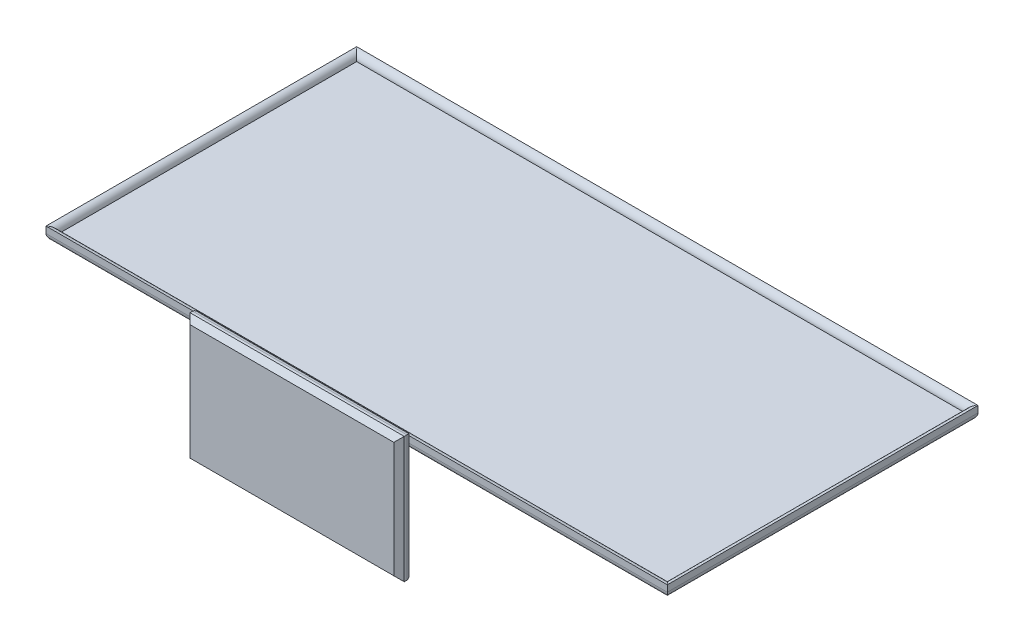
ISO-10303-21;
HEADER;
FILE_DESCRIPTION(('STEP AP214'),'2;1');
FILE_NAME('part.step','',(''),(''),'','','');
FILE_SCHEMA(('AUTOMOTIVE_DESIGN { 1 0 10303 214 1 1 1 1 }'));
ENDSEC;
DATA;
#1=APPLICATION_CONTEXT('core data for automotive mechanical design processes');
#2=APPLICATION_PROTOCOL_DEFINITION('international standard','automotive_design',2000,#1);
#3=PRODUCT_CONTEXT('',#1,'mechanical');
#4=PRODUCT('Part','Part','',(#3));
#5=PRODUCT_RELATED_PRODUCT_CATEGORY('part','',(#4));
#6=PRODUCT_DEFINITION_FORMATION('','',#4);
#7=PRODUCT_DEFINITION_CONTEXT('part definition',#1,'design');
#8=PRODUCT_DEFINITION('design','',#6,#7);
#9=PRODUCT_DEFINITION_SHAPE('','',#8);
#10=(LENGTH_UNIT() NAMED_UNIT(*) SI_UNIT(.MILLI.,.METRE.));
#11=(NAMED_UNIT(*) PLANE_ANGLE_UNIT() SI_UNIT($,.RADIAN.));
#12=(NAMED_UNIT(*) SI_UNIT($,.STERADIAN.) SOLID_ANGLE_UNIT());
#13=UNCERTAINTY_MEASURE_WITH_UNIT(LENGTH_MEASURE(1.E-05),#10,'distance_accuracy_value','');
#14=(GEOMETRIC_REPRESENTATION_CONTEXT(3) GLOBAL_UNCERTAINTY_ASSIGNED_CONTEXT((#13)) GLOBAL_UNIT_ASSIGNED_CONTEXT((#10,
#11,#12)) REPRESENTATION_CONTEXT('',''));
#15=CARTESIAN_POINT('',(0.,0.,0.));
#16=DIRECTION('',(0.,0.,1.));
#17=DIRECTION('',(1.,0.,0.));
#18=AXIS2_PLACEMENT_3D('',#15,#16,#17);
#19=CARTESIAN_POINT('',(-6.,0.25,3.));
#20=DIRECTION('',(0.,0.,-1.));
#21=DIRECTION('',(-1.,0.,0.));
#22=AXIS2_PLACEMENT_3D('',#19,#20,#21);
#23=PLANE('',#22);
#24=DIRECTION('',(0.,1.,0.));
#25=VECTOR('',#24,1.);
#26=CARTESIAN_POINT('',(0.148578956203547,0.,3.));
#27=LINE('',#26,#25);
#28=CARTESIAN_POINT('',(0.148578956203547,0.125,3.));
#29=VERTEX_POINT('',#28);
#30=CARTESIAN_POINT('',(0.148578956203547,0.150000000000001,3.));
#31=VERTEX_POINT('',#30);
#32=EDGE_CURVE('E544',#29,#31,#27,.T.);
#33=ORIENTED_EDGE('',*,*,#32,.F.);
#34=DIRECTION('',(1.,0.,0.));
#35=VECTOR('',#34,1.);
#36=CARTESIAN_POINT('',(6.,0.125,3.));
#37=LINE('',#36,#35);
#38=CARTESIAN_POINT('',(6.,0.125,3.));
#39=VERTEX_POINT('',#38);
#40=EDGE_CURVE('E499',#29,#39,#37,.T.);
#41=ORIENTED_EDGE('',*,*,#40,.T.);
#42=DIRECTION('',(0.,-1.,0.));
#43=VECTOR('',#42,1.);
#44=CARTESIAN_POINT('',(6.,0.25,3.));
#45=LINE('',#44,#43);
#46=CARTESIAN_POINT('',(6.,0.25,3.));
#47=VERTEX_POINT('',#46);
#48=EDGE_CURVE('E368',#47,#39,#45,.T.);
#49=ORIENTED_EDGE('',*,*,#48,.F.);
#50=DIRECTION('',(1.,0.,0.));
#51=VECTOR('',#50,1.);
#52=CARTESIAN_POINT('',(-6.,0.25,3.));
#53=LINE('',#52,#51);
#54=CARTESIAN_POINT('',(0.0485789562035491,0.25,3.));
#55=VERTEX_POINT('',#54);
#56=EDGE_CURVE('E365',#55,#47,#53,.T.);
#57=ORIENTED_EDGE('',*,*,#56,.F.);
#58=DIRECTION('',(-0.707106781186541,0.707106781186554,0.));
#59=VECTOR('',#58,1.);
#60=CARTESIAN_POINT('',(-2.97571052189817,3.27428947810178,3.));
#61=LINE('',#60,#59);
#62=EDGE_CURVE('E475',#55,#31,#61,.F.);
#63=ORIENTED_EDGE('',*,*,#62,.T.);
#64=EDGE_LOOP('',(#33,#41,#49,#57,#63));
#65=FACE_BOUND('',#64,.T.);
#66=ADVANCED_FACE('F153',(#65),#23,.F.);
#67=DIRECTION('',(0.,-1.,0.));
#68=VECTOR('',#67,1.);
#69=CARTESIAN_POINT('',(-6.,0.25,3.));
#70=LINE('',#69,#68);
#71=CARTESIAN_POINT('',(-6.,0.25,3.));
#72=VERTEX_POINT('',#71);
#73=CARTESIAN_POINT('',(-6.,0.125,3.));
#74=VERTEX_POINT('',#73);
#75=EDGE_CURVE('E371',#72,#74,#70,.T.);
#76=ORIENTED_EDGE('',*,*,#75,.T.);
#77=DIRECTION('',(1.,0.,0.));
#78=VECTOR('',#77,1.);
#79=CARTESIAN_POINT('',(-0.0514210437964555,0.125,3.));
#80=LINE('',#79,#78);
#81=CARTESIAN_POINT('',(-0.151421043796453,0.125,3.));
#82=VERTEX_POINT('',#81);
#83=EDGE_CURVE('E501',#74,#82,#80,.T.);
#84=ORIENTED_EDGE('',*,*,#83,.T.);
#85=DIRECTION('',(0.,-1.,0.));
#86=VECTOR('',#85,1.);
#87=CARTESIAN_POINT('',(-0.151421043796453,0.,3.));
#88=LINE('',#87,#86);
#89=CARTESIAN_POINT('',(-0.151421043796453,0.150000000000002,3.));
#90=VERTEX_POINT('',#89);
#91=EDGE_CURVE('E537',#90,#82,#88,.T.);
#92=ORIENTED_EDGE('',*,*,#91,.F.);
#93=DIRECTION('',(-0.707106781186554,-0.707106781186541,0.));
#94=VECTOR('',#93,1.);
#95=CARTESIAN_POINT('',(-3.02571052189828,-2.72428947810177,3.));
#96=LINE('',#95,#94);
#97=CARTESIAN_POINT('',(-0.0514210437964537,0.25,3.));
#98=VERTEX_POINT('',#97);
#99=EDGE_CURVE('E480',#90,#98,#96,.F.);
#100=ORIENTED_EDGE('',*,*,#99,.T.);
#101=EDGE_CURVE('E366',#72,#98,#53,.T.);
#102=ORIENTED_EDGE('',*,*,#101,.F.);
#103=EDGE_LOOP('',(#76,#84,#92,#100,#102));
#104=FACE_BOUND('',#103,.T.);
#105=ADVANCED_FACE('F536',(#104),#23,.F.);
#106=CARTESIAN_POINT('',(0.,0.25,0.));
#107=DIRECTION('',(0.,-1.,0.));
#108=DIRECTION('',(0.,0.,-1.));
#109=AXIS2_PLACEMENT_3D('',#106,#107,#108);
#110=PLANE('',#109);
#111=DIRECTION('',(-1.,0.,0.));
#112=VECTOR('',#111,1.);
#113=CARTESIAN_POINT('',(-0.151421043796453,0.25,4.));
#114=LINE('',#113,#112);
#115=CARTESIAN_POINT('',(0.0485789562035491,0.25,4.));
#116=VERTEX_POINT('',#115);
#117=CARTESIAN_POINT('',(-0.0514210437964538,0.25,4.));
#118=VERTEX_POINT('',#117);
#119=EDGE_CURVE('E547',#116,#118,#114,.T.);
#120=ORIENTED_EDGE('',*,*,#119,.F.);
#121=DIRECTION('',(0.,0.,-1.));
#122=VECTOR('',#121,1.);
#123=CARTESIAN_POINT('',(0.0485789562035491,0.25,0.));
#124=LINE('',#123,#122);
#125=EDGE_CURVE('E468',#116,#55,#124,.T.);
#126=ORIENTED_EDGE('',*,*,#125,.T.);
#127=DIRECTION('',(1.,0.,0.));
#128=VECTOR('',#127,1.);
#129=CARTESIAN_POINT('',(-5.875,0.25,3.));
#130=LINE('',#129,#128);
#131=EDGE_CURVE('E432',#55,#98,#130,.F.);
#132=ORIENTED_EDGE('',*,*,#131,.T.);
#133=DIRECTION('',(0.,0.,1.));
#134=VECTOR('',#133,1.);
#135=CARTESIAN_POINT('',(-0.0514210437964538,0.25,0.));
#136=LINE('',#135,#134);
#137=EDGE_CURVE('E466',#98,#118,#136,.T.);
#138=ORIENTED_EDGE('',*,*,#137,.T.);
#139=EDGE_LOOP('',(#120,#126,#132,#138));
#140=FACE_BOUND('',#139,.T.);
#141=ADVANCED_FACE('F644',(#140),#110,.F.);
#142=CARTESIAN_POINT('',(6.,0.25,3.));
#143=DIRECTION('',(-1.,0.,0.));
#144=DIRECTION('',(0.,0.,1.));
#145=AXIS2_PLACEMENT_3D('',#142,#143,#144);
#146=PLANE('',#145);
#147=ORIENTED_EDGE('',*,*,#48,.T.);
#148=DIRECTION('',(0.,0.,-1.));
#149=VECTOR('',#148,1.);
#150=CARTESIAN_POINT('',(6.,0.125,-3.));
#151=LINE('',#150,#149);
#152=CARTESIAN_POINT('',(6.,0.125,-3.));
#153=VERTEX_POINT('',#152);
#154=EDGE_CURVE('E485',#39,#153,#151,.T.);
#155=ORIENTED_EDGE('',*,*,#154,.T.);
#156=DIRECTION('',(0.,-1.,0.));
#157=VECTOR('',#156,1.);
#158=CARTESIAN_POINT('',(6.,0.25,-3.));
#159=LINE('',#158,#157);
#160=CARTESIAN_POINT('',(6.,0.25,-3.));
#161=VERTEX_POINT('',#160);
#162=EDGE_CURVE('E377',#161,#153,#159,.T.);
#163=ORIENTED_EDGE('',*,*,#162,.F.);
#164=DIRECTION('',(0.,0.,-1.));
#165=VECTOR('',#164,1.);
#166=CARTESIAN_POINT('',(6.,0.25,3.));
#167=LINE('',#166,#165);
#168=EDGE_CURVE('E334',#47,#161,#167,.T.);
#169=ORIENTED_EDGE('',*,*,#168,.F.);
#170=EDGE_LOOP('',(#147,#155,#163,#169));
#171=FACE_BOUND('',#170,.T.);
#172=ADVANCED_FACE('F656',(#171),#146,.F.);
#173=CARTESIAN_POINT('',(-6.,0.25,-3.));
#174=DIRECTION('',(0.,0.,1.));
#175=DIRECTION('',(1.,0.,0.));
#176=AXIS2_PLACEMENT_3D('',#173,#174,#175);
#177=PLANE('',#176);
#178=ORIENTED_EDGE('',*,*,#162,.T.);
#179=DIRECTION('',(-1.,0.,0.));
#180=VECTOR('',#179,1.);
#181=CARTESIAN_POINT('',(-6.,0.125,-3.));
#182=LINE('',#181,#180);
#183=CARTESIAN_POINT('',(-6.,0.125,-3.));
#184=VERTEX_POINT('',#183);
#185=EDGE_CURVE('E505',#153,#184,#182,.T.);
#186=ORIENTED_EDGE('',*,*,#185,.T.);
#187=DIRECTION('',(0.,-1.,0.));
#188=VECTOR('',#187,1.);
#189=CARTESIAN_POINT('',(-6.,0.25,-3.));
#190=LINE('',#189,#188);
#191=CARTESIAN_POINT('',(-6.,0.25,-3.));
#192=VERTEX_POINT('',#191);
#193=EDGE_CURVE('E374',#192,#184,#190,.T.);
#194=ORIENTED_EDGE('',*,*,#193,.F.);
#195=DIRECTION('',(-1.,0.,0.));
#196=VECTOR('',#195,1.);
#197=CARTESIAN_POINT('',(-6.,0.25,-3.));
#198=LINE('',#197,#196);
#199=EDGE_CURVE('E340',#161,#192,#198,.T.);
#200=ORIENTED_EDGE('',*,*,#199,.F.);
#201=EDGE_LOOP('',(#178,#186,#194,#200));
#202=FACE_BOUND('',#201,.T.);
#203=ADVANCED_FACE('F652',(#202),#177,.F.);
#204=CARTESIAN_POINT('',(-6.,0.25,3.));
#205=DIRECTION('',(1.,0.,0.));
#206=DIRECTION('',(0.,0.,-1.));
#207=AXIS2_PLACEMENT_3D('',#204,#205,#206);
#208=PLANE('',#207);
#209=ORIENTED_EDGE('',*,*,#193,.T.);
#210=DIRECTION('',(0.,0.,1.));
#211=VECTOR('',#210,1.);
#212=CARTESIAN_POINT('',(-6.,0.125,3.));
#213=LINE('',#212,#211);
#214=EDGE_CURVE('E503',#184,#74,#213,.T.);
#215=ORIENTED_EDGE('',*,*,#214,.T.);
#216=ORIENTED_EDGE('',*,*,#75,.F.);
#217=DIRECTION('',(0.,0.,1.));
#218=VECTOR('',#217,1.);
#219=CARTESIAN_POINT('',(-6.,0.25,3.));
#220=LINE('',#219,#218);
#221=EDGE_CURVE('E363',#192,#72,#220,.T.);
#222=ORIENTED_EDGE('',*,*,#221,.F.);
#223=EDGE_LOOP('',(#209,#215,#216,#222));
#224=FACE_BOUND('',#223,.T.);
#225=ADVANCED_FACE('F649',(#224),#208,.F.);
#226=CARTESIAN_POINT('',(0.,0.,0.));
#227=DIRECTION('',(0.,-1.,0.));
#228=DIRECTION('',(0.,0.,-1.));
#229=AXIS2_PLACEMENT_3D('',#226,#227,#228);
#230=PLANE('',#229);
#231=DIRECTION('',(1.,0.,0.));
#232=VECTOR('',#231,1.);
#233=CARTESIAN_POINT('',(0.0485789562035474,0.,2.875));
#234=LINE('',#233,#232);
#235=CARTESIAN_POINT('',(5.875,0.,2.875));
#236=VERTEX_POINT('',#235);
#237=CARTESIAN_POINT('',(0.0485789562035474,0.,2.875));
#238=VERTEX_POINT('',#237);
#239=EDGE_CURVE('E496',#236,#238,#234,.F.);
#240=ORIENTED_EDGE('',*,*,#239,.T.);
#241=DIRECTION('',(0.,0.,1.));
#242=VECTOR('',#241,1.);
#243=CARTESIAN_POINT('',(0.0485789562035474,0.,4.));
#244=LINE('',#243,#242);
#245=CARTESIAN_POINT('',(0.0485789562035474,0.,4.));
#246=VERTEX_POINT('',#245);
#247=EDGE_CURVE('E460',#238,#246,#244,.T.);
#248=ORIENTED_EDGE('',*,*,#247,.T.);
#249=DIRECTION('',(1.,0.,0.));
#250=VECTOR('',#249,1.);
#251=CARTESIAN_POINT('',(-0.151421043796453,0.,4.));
#252=LINE('',#251,#250);
#253=CARTESIAN_POINT('',(-0.0514210437964555,0.,4.));
#254=VERTEX_POINT('',#253);
#255=EDGE_CURVE('E554',#254,#246,#252,.T.);
#256=ORIENTED_EDGE('',*,*,#255,.F.);
#257=DIRECTION('',(0.,0.,-1.));
#258=VECTOR('',#257,1.);
#259=CARTESIAN_POINT('',(-0.0514210437964555,0.,3.));
#260=LINE('',#259,#258);
#261=CARTESIAN_POINT('',(-0.0514210437964555,0.,2.875));
#262=VERTEX_POINT('',#261);
#263=EDGE_CURVE('E458',#254,#262,#260,.T.);
#264=ORIENTED_EDGE('',*,*,#263,.T.);
#265=DIRECTION('',(1.,0.,0.));
#266=VECTOR('',#265,1.);
#267=CARTESIAN_POINT('',(-6.,0.,2.875));
#268=LINE('',#267,#266);
#269=CARTESIAN_POINT('',(-5.875,0.,2.875));
#270=VERTEX_POINT('',#269);
#271=EDGE_CURVE('E492',#262,#270,#268,.F.);
#272=ORIENTED_EDGE('',*,*,#271,.T.);
#273=DIRECTION('',(0.,0.,1.));
#274=VECTOR('',#273,1.);
#275=CARTESIAN_POINT('',(-5.875,0.,-3.));
#276=LINE('',#275,#274);
#277=CARTESIAN_POINT('',(-5.875,0.,-2.875));
#278=VERTEX_POINT('',#277);
#279=EDGE_CURVE('E490',#270,#278,#276,.F.);
#280=ORIENTED_EDGE('',*,*,#279,.T.);
#281=DIRECTION('',(-1.,0.,0.));
#282=VECTOR('',#281,1.);
#283=CARTESIAN_POINT('',(6.,0.,-2.875));
#284=LINE('',#283,#282);
#285=CARTESIAN_POINT('',(5.875,0.,-2.875));
#286=VERTEX_POINT('',#285);
#287=EDGE_CURVE('E488',#278,#286,#284,.F.);
#288=ORIENTED_EDGE('',*,*,#287,.T.);
#289=DIRECTION('',(0.,0.,-1.));
#290=VECTOR('',#289,1.);
#291=CARTESIAN_POINT('',(5.875,0.,3.));
#292=LINE('',#291,#290);
#293=EDGE_CURVE('E494',#286,#236,#292,.F.);
#294=ORIENTED_EDGE('',*,*,#293,.T.);
#295=EDGE_LOOP('',(#240,#248,#256,#264,#272,#280,#288,#294));
#296=FACE_BOUND('',#295,.T.);
#297=ADVANCED_FACE('F648',(#296),#230,.T.);
#298=CARTESIAN_POINT('',(0.,0.125,0.));
#299=DIRECTION('',(0.,-1.,0.));
#300=DIRECTION('',(0.,0.,-1.));
#301=AXIS2_PLACEMENT_3D('',#298,#299,#300);
#302=PLANE('',#301);
#303=DIRECTION('',(-1.,0.,0.));
#304=VECTOR('',#303,1.);
#305=CARTESIAN_POINT('',(5.875,0.125,-2.875));
#306=LINE('',#305,#304);
#307=CARTESIAN_POINT('',(5.875,0.125,-2.875));
#308=VERTEX_POINT('',#307);
#309=CARTESIAN_POINT('',(-5.875,0.125,-2.875));
#310=VERTEX_POINT('',#309);
#311=EDGE_CURVE('E322',#308,#310,#306,.T.);
#312=ORIENTED_EDGE('',*,*,#311,.T.);
#313=DIRECTION('',(0.,0.,1.));
#314=VECTOR('',#313,1.);
#315=CARTESIAN_POINT('',(-5.875,0.125,-2.875));
#316=LINE('',#315,#314);
#317=CARTESIAN_POINT('',(-5.875,0.125,2.875));
#318=VERTEX_POINT('',#317);
#319=EDGE_CURVE('E327',#310,#318,#316,.T.);
#320=ORIENTED_EDGE('',*,*,#319,.T.);
#321=DIRECTION('',(1.,0.,0.));
#322=VECTOR('',#321,1.);
#323=CARTESIAN_POINT('',(-5.875,0.125,2.875));
#324=LINE('',#323,#322);
#325=CARTESIAN_POINT('',(5.875,0.125,2.875));
#326=VERTEX_POINT('',#325);
#327=EDGE_CURVE('E350',#318,#326,#324,.T.);
#328=ORIENTED_EDGE('',*,*,#327,.T.);
#329=DIRECTION('',(0.,0.,-1.));
#330=VECTOR('',#329,1.);
#331=CARTESIAN_POINT('',(5.875,0.125,2.875));
#332=LINE('',#331,#330);
#333=EDGE_CURVE('E330',#326,#308,#332,.T.);
#334=ORIENTED_EDGE('',*,*,#333,.T.);
#335=EDGE_LOOP('',(#312,#320,#328,#334));
#336=FACE_BOUND('',#335,.T.);
#337=ADVANCED_FACE('F324',(#336),#302,.F.);
#338=CARTESIAN_POINT('',(0.148578956203547,0.,4.));
#339=DIRECTION('',(-1.,0.,0.));
#340=DIRECTION('',(0.,0.,1.));
#341=AXIS2_PLACEMENT_3D('',#338,#339,#340);
#342=PLANE('',#341);
#343=DIRECTION('',(0.,1.,0.));
#344=VECTOR('',#343,1.);
#345=CARTESIAN_POINT('',(0.148578956203547,0.,4.));
#346=LINE('',#345,#344);
#347=CARTESIAN_POINT('',(0.148578956203547,0.0999999999999977,4.));
#348=VERTEX_POINT('',#347);
#349=CARTESIAN_POINT('',(0.148578956203547,0.150000000000001,4.));
#350=VERTEX_POINT('',#349);
#351=EDGE_CURVE('E543',#348,#350,#346,.T.);
#352=ORIENTED_EDGE('',*,*,#351,.F.);
#353=DIRECTION('',(0.,0.,-1.));
#354=VECTOR('',#353,1.);
#355=CARTESIAN_POINT('',(0.148578956203547,0.0999999999999977,3.));
#356=LINE('',#355,#354);
#357=CARTESIAN_POINT('',(0.148578956203547,0.0999999999999977,2.99747448713916));
#358=VERTEX_POINT('',#357);
#359=EDGE_CURVE('E177',#348,#358,#356,.T.);
#360=ORIENTED_EDGE('',*,*,#359,.T.);
#361=CARTESIAN_POINT('',(0.148578956203547,0.125,2.875));
#362=DIRECTION('',(-1.,0.,0.));
#363=DIRECTION('',(0.,0.,1.));
#364=AXIS2_PLACEMENT_3D('',#361,#362,#363);
#365=CIRCLE('',#364,0.125);
#366=EDGE_CURVE('E509',#358,#29,#365,.T.);
#367=ORIENTED_EDGE('',*,*,#366,.T.);
#368=ORIENTED_EDGE('',*,*,#32,.T.);
#369=DIRECTION('',(0.,0.,1.));
#370=VECTOR('',#369,1.);
#371=CARTESIAN_POINT('',(0.148578956203547,0.150000000000001,4.));
#372=LINE('',#371,#370);
#373=EDGE_CURVE('E443',#31,#350,#372,.T.);
#374=ORIENTED_EDGE('',*,*,#373,.T.);
#375=EDGE_LOOP('',(#352,#360,#367,#368,#374));
#376=FACE_BOUND('',#375,.T.);
#377=ADVANCED_FACE('F686',(#376),#342,.F.);
#378=CARTESIAN_POINT('',(-0.151421043796453,0.,4.));
#379=DIRECTION('',(1.,0.,0.));
#380=DIRECTION('',(0.,0.,-1.));
#381=AXIS2_PLACEMENT_3D('',#378,#379,#380);
#382=PLANE('',#381);
#383=ORIENTED_EDGE('',*,*,#91,.T.);
#384=CARTESIAN_POINT('',(-0.151421043796453,0.125,2.875));
#385=DIRECTION('',(1.,0.,0.));
#386=DIRECTION('',(0.,0.,-1.));
#387=AXIS2_PLACEMENT_3D('',#384,#385,#386);
#388=CIRCLE('',#387,0.125);
#389=CARTESIAN_POINT('',(-0.151421043796453,0.0999999999999994,2.99747448713916));
#390=VERTEX_POINT('',#389);
#391=EDGE_CURVE('E162',#82,#390,#388,.T.);
#392=ORIENTED_EDGE('',*,*,#391,.T.);
#393=DIRECTION('',(0.,0.,1.));
#394=VECTOR('',#393,1.);
#395=CARTESIAN_POINT('',(-0.151421043796453,0.0999999999999994,4.));
#396=LINE('',#395,#394);
#397=CARTESIAN_POINT('',(-0.151421043796453,0.0999999999999994,4.));
#398=VERTEX_POINT('',#397);
#399=EDGE_CURVE('E169',#390,#398,#396,.T.);
#400=ORIENTED_EDGE('',*,*,#399,.T.);
#401=DIRECTION('',(0.,-1.,0.));
#402=VECTOR('',#401,1.);
#403=CARTESIAN_POINT('',(-0.151421043796453,0.,4.));
#404=LINE('',#403,#402);
#405=CARTESIAN_POINT('',(-0.151421043796453,0.150000000000002,4.));
#406=VERTEX_POINT('',#405);
#407=EDGE_CURVE('E557',#406,#398,#404,.T.);
#408=ORIENTED_EDGE('',*,*,#407,.F.);
#409=DIRECTION('',(0.,0.,-1.));
#410=VECTOR('',#409,1.);
#411=CARTESIAN_POINT('',(-0.151421043796453,0.150000000000002,4.));
#412=LINE('',#411,#410);
#413=EDGE_CURVE('E462',#406,#90,#412,.T.);
#414=ORIENTED_EDGE('',*,*,#413,.T.);
#415=EDGE_LOOP('',(#383,#392,#400,#408,#414));
#416=FACE_BOUND('',#415,.T.);
#417=ADVANCED_FACE('F540',(#416),#382,.F.);
#418=CARTESIAN_POINT('',(2.06809312727264,-1.09131512494069,4.25));
#419=DIRECTION('',(-1.,0.,0.));
#420=DIRECTION('',(0.,0.,1.));
#421=AXIS2_PLACEMENT_3D('',#418,#419,#420);
#422=PLANE('',#421);
#423=DIRECTION('',(0.,0.,-1.));
#424=VECTOR('',#423,1.);
#425=CARTESIAN_POINT('',(2.06809312727264,1.34131512494069,4.25));
#426=LINE('',#425,#424);
#427=CARTESIAN_POINT('',(2.06809312727264,1.34131512494069,4.15));
#428=VERTEX_POINT('',#427);
#429=CARTESIAN_POINT('',(2.06809312727264,1.34131512494069,4.1));
#430=VERTEX_POINT('',#429);
#431=EDGE_CURVE('E549',#428,#430,#426,.T.);
#432=ORIENTED_EDGE('',*,*,#431,.F.);
#433=DIRECTION('',(0.,-1.,0.));
#434=VECTOR('',#433,1.);
#435=CARTESIAN_POINT('',(2.06809312727264,-1.09131512494069,4.15));
#436=LINE('',#435,#434);
#437=CARTESIAN_POINT('',(2.06809312727264,-1.09131512494069,4.15));
#438=VERTEX_POINT('',#437);
#439=EDGE_CURVE('E428',#428,#438,#436,.T.);
#440=ORIENTED_EDGE('',*,*,#439,.T.);
#441=DIRECTION('',(0.,0.,-1.));
#442=VECTOR('',#441,1.);
#443=CARTESIAN_POINT('',(2.06809312727264,-1.09131512494069,4.25));
#444=LINE('',#443,#442);
#445=CARTESIAN_POINT('',(2.06809312727264,-1.09131512494069,4.1));
#446=VERTEX_POINT('',#445);
#447=EDGE_CURVE('E414',#438,#446,#444,.T.);
#448=ORIENTED_EDGE('',*,*,#447,.T.);
#449=DIRECTION('',(0.,1.,0.));
#450=VECTOR('',#449,1.);
#451=CARTESIAN_POINT('',(2.06809312727264,1.34131512494069,4.1));
#452=LINE('',#451,#450);
#453=EDGE_CURVE('E395',#446,#430,#452,.T.);
#454=ORIENTED_EDGE('',*,*,#453,.T.);
#455=EDGE_LOOP('',(#432,#440,#448,#454));
#456=FACE_BOUND('',#455,.T.);
#457=ADVANCED_FACE('F574',(#456),#422,.F.);
#458=CARTESIAN_POINT('',(-2.06809312727264,1.34131512494069,4.25));
#459=DIRECTION('',(0.,-1.,0.));
#460=DIRECTION('',(0.,0.,-1.));
#461=AXIS2_PLACEMENT_3D('',#458,#459,#460);
#462=PLANE('',#461);
#463=DIRECTION('',(0.,0.,-1.));
#464=VECTOR('',#463,1.);
#465=CARTESIAN_POINT('',(-2.06809312727264,1.34131512494069,4.25));
#466=LINE('',#465,#464);
#467=CARTESIAN_POINT('',(-2.06809312727264,1.34131512494069,4.15));
#468=VERTEX_POINT('',#467);
#469=CARTESIAN_POINT('',(-2.06809312727264,1.34131512494069,4.1));
#470=VERTEX_POINT('',#469);
#471=EDGE_CURVE('E567',#468,#470,#466,.T.);
#472=ORIENTED_EDGE('',*,*,#471,.F.);
#473=DIRECTION('',(1.,0.,0.));
#474=VECTOR('',#473,1.);
#475=CARTESIAN_POINT('',(-2.06809312727264,1.34131512494069,4.15));
#476=LINE('',#475,#474);
#477=EDGE_CURVE('E430',#468,#428,#476,.T.);
#478=ORIENTED_EDGE('',*,*,#477,.T.);
#479=ORIENTED_EDGE('',*,*,#431,.T.);
#480=DIRECTION('',(-1.,0.,0.));
#481=VECTOR('',#480,1.);
#482=CARTESIAN_POINT('',(-2.06809312727264,1.34131512494069,4.1));
#483=LINE('',#482,#481);
#484=EDGE_CURVE('E398',#430,#470,#483,.T.);
#485=ORIENTED_EDGE('',*,*,#484,.T.);
#486=EDGE_LOOP('',(#472,#478,#479,#485));
#487=FACE_BOUND('',#486,.T.);
#488=ADVANCED_FACE('F604',(#487),#462,.F.);
#489=CARTESIAN_POINT('',(-2.06809312727264,-1.09131512494069,4.25));
#490=DIRECTION('',(1.,0.,0.));
#491=DIRECTION('',(0.,0.,-1.));
#492=AXIS2_PLACEMENT_3D('',#489,#490,#491);
#493=PLANE('',#492);
#494=DIRECTION('',(0.,0.,-1.));
#495=VECTOR('',#494,1.);
#496=CARTESIAN_POINT('',(-2.06809312727264,-1.09131512494069,4.25));
#497=LINE('',#496,#495);
#498=CARTESIAN_POINT('',(-2.06809312727264,-1.09131512494069,4.15));
#499=VERTEX_POINT('',#498);
#500=CARTESIAN_POINT('',(-2.06809312727264,-1.09131512494069,4.1));
#501=VERTEX_POINT('',#500);
#502=EDGE_CURVE('E569',#499,#501,#497,.T.);
#503=ORIENTED_EDGE('',*,*,#502,.F.);
#504=DIRECTION('',(0.,1.,0.));
#505=VECTOR('',#504,1.);
#506=CARTESIAN_POINT('',(-2.06809312727264,-1.09131512494069,4.15));
#507=LINE('',#506,#505);
#508=EDGE_CURVE('E423',#499,#468,#507,.T.);
#509=ORIENTED_EDGE('',*,*,#508,.T.);
#510=ORIENTED_EDGE('',*,*,#471,.T.);
#511=DIRECTION('',(0.,-1.,0.));
#512=VECTOR('',#511,1.);
#513=CARTESIAN_POINT('',(-2.06809312727264,-1.09131512494069,4.1));
#514=LINE('',#513,#512);
#515=EDGE_CURVE('E380',#470,#501,#514,.T.);
#516=ORIENTED_EDGE('',*,*,#515,.T.);
#517=EDGE_LOOP('',(#503,#509,#510,#516));
#518=FACE_BOUND('',#517,.T.);
#519=ADVANCED_FACE('F624',(#518),#493,.F.);
#520=CARTESIAN_POINT('',(-2.06809312727264,-1.09131512494069,4.25));
#521=DIRECTION('',(0.,1.,0.));
#522=DIRECTION('',(0.,0.,1.));
#523=AXIS2_PLACEMENT_3D('',#520,#521,#522);
#524=PLANE('',#523);
#525=ORIENTED_EDGE('',*,*,#447,.F.);
#526=DIRECTION('',(-1.,0.,0.));
#527=VECTOR('',#526,1.);
#528=CARTESIAN_POINT('',(-2.06809312727264,-1.09131512494069,4.15));
#529=LINE('',#528,#527);
#530=EDGE_CURVE('E426',#438,#499,#529,.T.);
#531=ORIENTED_EDGE('',*,*,#530,.T.);
#532=ORIENTED_EDGE('',*,*,#502,.T.);
#533=DIRECTION('',(1.,0.,0.));
#534=VECTOR('',#533,1.);
#535=CARTESIAN_POINT('',(2.06809312727264,-1.09131512494069,4.1));
#536=LINE('',#535,#534);
#537=EDGE_CURVE('E392',#501,#446,#536,.T.);
#538=ORIENTED_EDGE('',*,*,#537,.T.);
#539=EDGE_LOOP('',(#525,#531,#532,#538));
#540=FACE_BOUND('',#539,.T.);
#541=ADVANCED_FACE('F581',(#540),#524,.F.);
#542=CARTESIAN_POINT('',(0.,0.,4.25));
#543=DIRECTION('',(0.,0.,-1.));
#544=DIRECTION('',(-1.,0.,0.));
#545=AXIS2_PLACEMENT_3D('',#542,#543,#544);
#546=PLANE('',#545);
#547=DIRECTION('',(-1.,0.,0.));
#548=VECTOR('',#547,1.);
#549=CARTESIAN_POINT('',(0.,1.24131512494069,4.25));
#550=LINE('',#549,#548);
#551=CARTESIAN_POINT('',(1.96809312727264,1.24131512494069,4.25));
#552=VERTEX_POINT('',#551);
#553=CARTESIAN_POINT('',(-1.96809312727264,1.24131512494069,4.25));
#554=VERTEX_POINT('',#553);
#555=EDGE_CURVE('E401',#552,#554,#550,.T.);
#556=ORIENTED_EDGE('',*,*,#555,.T.);
#557=DIRECTION('',(0.,-1.,0.));
#558=VECTOR('',#557,1.);
#559=CARTESIAN_POINT('',(-1.96809312727264,0.,4.25));
#560=LINE('',#559,#558);
#561=CARTESIAN_POINT('',(-1.96809312727264,-0.99131512494069,4.25));
#562=VERTEX_POINT('',#561);
#563=EDGE_CURVE('E420',#554,#562,#560,.T.);
#564=ORIENTED_EDGE('',*,*,#563,.T.);
#565=DIRECTION('',(1.,0.,0.));
#566=VECTOR('',#565,1.);
#567=CARTESIAN_POINT('',(0.,-0.99131512494069,4.25));
#568=LINE('',#567,#566);
#569=CARTESIAN_POINT('',(1.96809312727264,-0.99131512494069,4.25));
#570=VERTEX_POINT('',#569);
#571=EDGE_CURVE('E418',#562,#570,#568,.T.);
#572=ORIENTED_EDGE('',*,*,#571,.T.);
#573=DIRECTION('',(0.,1.,0.));
#574=VECTOR('',#573,1.);
#575=CARTESIAN_POINT('',(1.96809312727264,0.,4.25));
#576=LINE('',#575,#574);
#577=EDGE_CURVE('E416',#570,#552,#576,.T.);
#578=ORIENTED_EDGE('',*,*,#577,.T.);
#579=EDGE_LOOP('',(#556,#564,#572,#578));
#580=FACE_BOUND('',#579,.T.);
#581=ADVANCED_FACE('F617',(#580),#546,.F.);
#582=CARTESIAN_POINT('',(0.,0.,4.));
#583=DIRECTION('',(0.,0.,-1.));
#584=DIRECTION('',(-1.,0.,0.));
#585=AXIS2_PLACEMENT_3D('',#582,#583,#584);
#586=PLANE('',#585);
#587=DIRECTION('',(1.,0.,0.));
#588=VECTOR('',#587,1.);
#589=CARTESIAN_POINT('',(-2.06809312727264,-0.991315124940689,4.));
#590=LINE('',#589,#588);
#591=CARTESIAN_POINT('',(1.96809312727264,-0.991315124940689,4.));
#592=VERTEX_POINT('',#591);
#593=CARTESIAN_POINT('',(-1.96809312727264,-0.991315124940689,4.));
#594=VERTEX_POINT('',#593);
#595=EDGE_CURVE('E387',#592,#594,#590,.F.);
#596=ORIENTED_EDGE('',*,*,#595,.T.);
#597=DIRECTION('',(0.,-1.,0.));
#598=VECTOR('',#597,1.);
#599=CARTESIAN_POINT('',(-1.96809312727264,1.34131512494069,4.));
#600=LINE('',#599,#598);
#601=CARTESIAN_POINT('',(-1.96809312727264,1.24131512494069,4.));
#602=VERTEX_POINT('',#601);
#603=EDGE_CURVE('E389',#594,#602,#600,.F.);
#604=ORIENTED_EDGE('',*,*,#603,.T.);
#605=DIRECTION('',(-1.,0.,0.));
#606=VECTOR('',#605,1.);
#607=CARTESIAN_POINT('',(2.06809312727264,1.24131512494069,4.));
#608=LINE('',#607,#606);
#609=CARTESIAN_POINT('',(1.96809312727264,1.24131512494069,4.));
#610=VERTEX_POINT('',#609);
#611=EDGE_CURVE('E383',#602,#610,#608,.F.);
#612=ORIENTED_EDGE('',*,*,#611,.T.);
#613=DIRECTION('',(0.,1.,0.));
#614=VECTOR('',#613,1.);
#615=CARTESIAN_POINT('',(1.96809312727264,-1.09131512494069,4.));
#616=LINE('',#615,#614);
#617=EDGE_CURVE('E385',#610,#592,#616,.F.);
#618=ORIENTED_EDGE('',*,*,#617,.T.);
#619=EDGE_LOOP('',(#596,#604,#612,#618));
#620=FACE_BOUND('',#619,.T.);
#621=ORIENTED_EDGE('',*,*,#407,.T.);
#622=DIRECTION('',(0.707106781186541,-0.707106781186554,0.));
#623=VECTOR('',#622,1.);
#624=CARTESIAN_POINT('',(-0.0514210437964555,0.,4.));
#625=LINE('',#624,#623);
#626=EDGE_CURVE('E473',#398,#254,#625,.T.);
#627=ORIENTED_EDGE('',*,*,#626,.T.);
#628=ORIENTED_EDGE('',*,*,#255,.T.);
#629=DIRECTION('',(0.707106781186554,0.707106781186541,0.));
#630=VECTOR('',#629,1.);
#631=CARTESIAN_POINT('',(0.148578956203547,0.0999999999999977,4.));
#632=LINE('',#631,#630);
#633=EDGE_CURVE('E471',#246,#348,#632,.T.);
#634=ORIENTED_EDGE('',*,*,#633,.T.);
#635=ORIENTED_EDGE('',*,*,#351,.T.);
#636=DIRECTION('',(0.707106781186541,-0.707106781186554,0.));
#637=VECTOR('',#636,1.);
#638=CARTESIAN_POINT('',(0.0485789562035491,0.25,4.));
#639=LINE('',#638,#637);
#640=EDGE_CURVE('E478',#350,#116,#639,.F.);
#641=ORIENTED_EDGE('',*,*,#640,.T.);
#642=ORIENTED_EDGE('',*,*,#119,.T.);
#643=DIRECTION('',(0.707106781186554,0.707106781186541,0.));
#644=VECTOR('',#643,1.);
#645=CARTESIAN_POINT('',(-0.151421043796453,0.150000000000002,4.));
#646=LINE('',#645,#644);
#647=EDGE_CURVE('E483',#118,#406,#646,.F.);
#648=ORIENTED_EDGE('',*,*,#647,.T.);
#649=EDGE_LOOP('',(#621,#627,#628,#634,#635,#641,#642,#648));
#650=FACE_BOUND('',#649,.T.);
#651=ADVANCED_FACE('F594',(#620,#650),#586,.T.);
#652=CARTESIAN_POINT('',(1.96809312727264,-1.09131512494069,4.1));
#653=DIRECTION('',(0.,-1.,0.));
#654=DIRECTION('',(0.,0.,-1.));
#655=AXIS2_PLACEMENT_3D('',#652,#653,#654);
#656=CYLINDRICAL_SURFACE('',#655,0.1);
#657=CARTESIAN_POINT('',(1.96809312727264,-0.991315124940689,4.1));
#658=DIRECTION('',(-0.707106781186547,-0.707106781186547,0.));
#659=DIRECTION('',(0.707106781186547,-0.707106781186547,0.));
#660=AXIS2_PLACEMENT_3D('',#657,#658,#659);
#661=ELLIPSE('',#660,0.14142135623731,0.1);
#662=EDGE_CURVE('E408',#592,#446,#661,.T.);
#663=ORIENTED_EDGE('',*,*,#662,.F.);
#664=ORIENTED_EDGE('',*,*,#617,.F.);
#665=CARTESIAN_POINT('',(1.96809312727264,1.24131512494069,4.1));
#666=DIRECTION('',(0.707106781186547,-0.707106781186547,0.));
#667=DIRECTION('',(0.707106781186547,0.707106781186547,0.));
#668=AXIS2_PLACEMENT_3D('',#665,#666,#667);
#669=ELLIPSE('',#668,0.14142135623731,0.1);
#670=EDGE_CURVE('E411',#430,#610,#669,.F.);
#671=ORIENTED_EDGE('',*,*,#670,.F.);
#672=ORIENTED_EDGE('',*,*,#453,.F.);
#673=EDGE_LOOP('',(#663,#664,#671,#672));
#674=FACE_BOUND('',#673,.T.);
#675=ADVANCED_FACE('F587',(#674),#656,.T.);
#676=CARTESIAN_POINT('',(-2.06809312727264,1.24131512494069,4.1));
#677=DIRECTION('',(1.,0.,0.));
#678=DIRECTION('',(0.,0.,-1.));
#679=AXIS2_PLACEMENT_3D('',#676,#677,#678);
#680=CYLINDRICAL_SURFACE('',#679,0.1);
#681=ORIENTED_EDGE('',*,*,#670,.T.);
#682=ORIENTED_EDGE('',*,*,#611,.F.);
#683=CARTESIAN_POINT('',(-1.96809312727264,1.24131512494069,4.1));
#684=DIRECTION('',(0.707106781186547,0.707106781186547,0.));
#685=DIRECTION('',(0.707106781186547,-0.707106781186547,0.));
#686=AXIS2_PLACEMENT_3D('',#683,#684,#685);
#687=ELLIPSE('',#686,0.14142135623731,0.1);
#688=EDGE_CURVE('E405',#470,#602,#687,.F.);
#689=ORIENTED_EDGE('',*,*,#688,.F.);
#690=ORIENTED_EDGE('',*,*,#484,.F.);
#691=EDGE_LOOP('',(#681,#682,#689,#690));
#692=FACE_BOUND('',#691,.T.);
#693=ADVANCED_FACE('F601',(#692),#680,.T.);
#694=CARTESIAN_POINT('',(-2.06809312727264,-0.991315124940689,4.1));
#695=DIRECTION('',(-1.,0.,0.));
#696=DIRECTION('',(0.,0.,1.));
#697=AXIS2_PLACEMENT_3D('',#694,#695,#696);
#698=CYLINDRICAL_SURFACE('',#697,0.1);
#699=ORIENTED_EDGE('',*,*,#662,.T.);
#700=ORIENTED_EDGE('',*,*,#537,.F.);
#701=CARTESIAN_POINT('',(-1.96809312727264,-0.991315124940689,4.1));
#702=DIRECTION('',(-0.707106781186547,0.707106781186547,0.));
#703=DIRECTION('',(-0.707106781186547,-0.707106781186547,0.));
#704=AXIS2_PLACEMENT_3D('',#701,#702,#703);
#705=ELLIPSE('',#704,0.14142135623731,0.1);
#706=EDGE_CURVE('E402',#594,#501,#705,.T.);
#707=ORIENTED_EDGE('',*,*,#706,.F.);
#708=ORIENTED_EDGE('',*,*,#595,.F.);
#709=EDGE_LOOP('',(#699,#700,#707,#708));
#710=FACE_BOUND('',#709,.T.);
#711=ADVANCED_FACE('F591',(#710),#698,.T.);
#712=CARTESIAN_POINT('',(-1.96809312727264,-1.09131512494069,4.1));
#713=DIRECTION('',(0.,1.,0.));
#714=DIRECTION('',(0.,0.,1.));
#715=AXIS2_PLACEMENT_3D('',#712,#713,#714);
#716=CYLINDRICAL_SURFACE('',#715,0.1);
#717=ORIENTED_EDGE('',*,*,#688,.T.);
#718=ORIENTED_EDGE('',*,*,#603,.F.);
#719=ORIENTED_EDGE('',*,*,#706,.T.);
#720=ORIENTED_EDGE('',*,*,#515,.F.);
#721=EDGE_LOOP('',(#717,#718,#719,#720));
#722=FACE_BOUND('',#721,.T.);
#723=ADVANCED_FACE('F596',(#722),#716,.T.);
#724=CARTESIAN_POINT('',(1.96809312727264,0.,4.25));
#725=DIRECTION('',(-0.707106781186548,0.,-0.707106781186548));
#726=DIRECTION('',(0.,1.,0.));
#727=AXIS2_PLACEMENT_3D('',#724,#725,#726);
#728=PLANE('',#727);
#729=DIRECTION('',(0.577350269189626,-0.577350269189626,-0.577350269189626));
#730=VECTOR('',#729,1.);
#731=CARTESIAN_POINT('',(1.63765475229241,-0.66087674996046,4.58043837498023));
#732=LINE('',#731,#730);
#733=EDGE_CURVE('E436',#438,#570,#732,.F.);
#734=ORIENTED_EDGE('',*,*,#733,.F.);
#735=ORIENTED_EDGE('',*,*,#439,.F.);
#736=DIRECTION('',(0.577350269189626,0.577350269189626,-0.577350269189626));
#737=VECTOR('',#736,1.);
#738=CARTESIAN_POINT('',(1.31206208484842,0.585284082516478,4.90603104242421));
#739=LINE('',#738,#737);
#740=EDGE_CURVE('E406',#552,#428,#739,.T.);
#741=ORIENTED_EDGE('',*,*,#740,.F.);
#742=ORIENTED_EDGE('',*,*,#577,.F.);
#743=EDGE_LOOP('',(#734,#735,#741,#742));
#744=FACE_BOUND('',#743,.T.);
#745=ADVANCED_FACE('F608',(#744),#728,.F.);
#746=CARTESIAN_POINT('',(0.,1.24131512494069,4.25));
#747=DIRECTION('',(0.,-0.707106781186548,-0.707106781186548));
#748=DIRECTION('',(-1.,0.,0.));
#749=AXIS2_PLACEMENT_3D('',#746,#747,#748);
#750=PLANE('',#749);
#751=ORIENTED_EDGE('',*,*,#740,.T.);
#752=ORIENTED_EDGE('',*,*,#477,.F.);
#753=DIRECTION('',(0.577350269189626,-0.577350269189626,0.577350269189626));
#754=VECTOR('',#753,1.);
#755=CARTESIAN_POINT('',(-1.31206208484842,0.585284082516478,4.90603104242421));
#756=LINE('',#755,#754);
#757=EDGE_CURVE('E434',#554,#468,#756,.F.);
#758=ORIENTED_EDGE('',*,*,#757,.F.);
#759=ORIENTED_EDGE('',*,*,#555,.F.);
#760=EDGE_LOOP('',(#751,#752,#758,#759));
#761=FACE_BOUND('',#760,.T.);
#762=ADVANCED_FACE('F613',(#761),#750,.F.);
#763=CARTESIAN_POINT('',(0.,-0.99131512494069,4.25));
#764=DIRECTION('',(0.,0.707106781186548,-0.707106781186548));
#765=DIRECTION('',(1.,0.,0.));
#766=AXIS2_PLACEMENT_3D('',#763,#764,#765);
#767=PLANE('',#766);
#768=ORIENTED_EDGE('',*,*,#733,.T.);
#769=ORIENTED_EDGE('',*,*,#571,.F.);
#770=DIRECTION('',(-0.577350269189626,-0.577350269189626,-0.577350269189626));
#771=VECTOR('',#770,1.);
#772=CARTESIAN_POINT('',(-1.31206208484842,-0.335284082516478,4.90603104242421));
#773=LINE('',#772,#771);
#774=EDGE_CURVE('E343',#499,#562,#773,.F.);
#775=ORIENTED_EDGE('',*,*,#774,.F.);
#776=ORIENTED_EDGE('',*,*,#530,.F.);
#777=EDGE_LOOP('',(#768,#769,#775,#776));
#778=FACE_BOUND('',#777,.T.);
#779=ADVANCED_FACE('F620',(#778),#767,.F.);
#780=CARTESIAN_POINT('',(-1.96809312727264,0.,4.25));
#781=DIRECTION('',(0.707106781186548,0.,-0.707106781186548));
#782=DIRECTION('',(0.,-1.,0.));
#783=AXIS2_PLACEMENT_3D('',#780,#781,#782);
#784=PLANE('',#783);
#785=ORIENTED_EDGE('',*,*,#757,.T.);
#786=ORIENTED_EDGE('',*,*,#508,.F.);
#787=ORIENTED_EDGE('',*,*,#774,.T.);
#788=ORIENTED_EDGE('',*,*,#563,.F.);
#789=EDGE_LOOP('',(#785,#786,#787,#788));
#790=FACE_BOUND('',#789,.T.);
#791=ADVANCED_FACE('F626',(#790),#784,.F.);
#792=CARTESIAN_POINT('',(5.875,0.125,-3.));
#793=DIRECTION('',(1.,0.,0.));
#794=DIRECTION('',(0.,0.,-1.));
#795=AXIS2_PLACEMENT_3D('',#792,#793,#794);
#796=CYLINDRICAL_SURFACE('',#795,0.125);
#797=CARTESIAN_POINT('',(6.,0.125,-3.));
#798=DIRECTION('',(0.707106781186548,0.,0.707106781186547));
#799=DIRECTION('',(0.707106781186547,0.,-0.707106781186548));
#800=AXIS2_PLACEMENT_3D('',#797,#798,#799);
#801=ELLIPSE('',#800,0.176776695296637,0.125);
#802=EDGE_CURVE('E344',#161,#308,#801,.T.);
#803=ORIENTED_EDGE('',*,*,#802,.F.);
#804=ORIENTED_EDGE('',*,*,#199,.T.);
#805=CARTESIAN_POINT('',(-6.,0.125,-3.));
#806=DIRECTION('',(0.707106781186548,0.,-0.707106781186547));
#807=DIRECTION('',(-0.707106781186547,0.,-0.707106781186548));
#808=AXIS2_PLACEMENT_3D('',#805,#806,#807);
#809=ELLIPSE('',#808,0.176776695296637,0.125);
#810=EDGE_CURVE('E338',#310,#192,#809,.F.);
#811=ORIENTED_EDGE('',*,*,#810,.F.);
#812=ORIENTED_EDGE('',*,*,#311,.F.);
#813=EDGE_LOOP('',(#803,#804,#811,#812));
#814=FACE_BOUND('',#813,.T.);
#815=ADVANCED_FACE('F339',(#814),#796,.T.);
#816=CARTESIAN_POINT('',(-6.,0.125,-2.875));
#817=DIRECTION('',(0.,0.,-1.));
#818=DIRECTION('',(-1.,0.,0.));
#819=AXIS2_PLACEMENT_3D('',#816,#817,#818);
#820=CYLINDRICAL_SURFACE('',#819,0.125);
#821=ORIENTED_EDGE('',*,*,#810,.T.);
#822=ORIENTED_EDGE('',*,*,#221,.T.);
#823=CARTESIAN_POINT('',(-6.,0.125,3.));
#824=DIRECTION('',(-0.707106781186547,0.,-0.707106781186548));
#825=DIRECTION('',(-0.707106781186548,0.,0.707106781186547));
#826=AXIS2_PLACEMENT_3D('',#823,#824,#825);
#827=ELLIPSE('',#826,0.176776695296637,0.125);
#828=EDGE_CURVE('E348',#318,#72,#827,.F.);
#829=ORIENTED_EDGE('',*,*,#828,.F.);
#830=ORIENTED_EDGE('',*,*,#319,.F.);
#831=EDGE_LOOP('',(#821,#822,#829,#830));
#832=FACE_BOUND('',#831,.T.);
#833=ADVANCED_FACE('F346',(#832),#820,.T.);
#834=CARTESIAN_POINT('',(6.,0.125,2.875));
#835=DIRECTION('',(0.,0.,1.));
#836=DIRECTION('',(1.,0.,0.));
#837=AXIS2_PLACEMENT_3D('',#834,#835,#836);
#838=CYLINDRICAL_SURFACE('',#837,0.125);
#839=ORIENTED_EDGE('',*,*,#802,.T.);
#840=ORIENTED_EDGE('',*,*,#333,.F.);
#841=CARTESIAN_POINT('',(6.,0.125,3.));
#842=DIRECTION('',(-0.707106781186547,0.,0.707106781186548));
#843=DIRECTION('',(-0.707106781186548,0.,-0.707106781186547));
#844=AXIS2_PLACEMENT_3D('',#841,#842,#843);
#845=ELLIPSE('',#844,0.176776695296637,0.125);
#846=EDGE_CURVE('E444',#47,#326,#845,.T.);
#847=ORIENTED_EDGE('',*,*,#846,.F.);
#848=ORIENTED_EDGE('',*,*,#168,.T.);
#849=EDGE_LOOP('',(#839,#840,#847,#848));
#850=FACE_BOUND('',#849,.T.);
#851=ADVANCED_FACE('F745',(#850),#838,.T.);
#852=CARTESIAN_POINT('',(-5.875,0.125,3.));
#853=DIRECTION('',(-1.,0.,0.));
#854=DIRECTION('',(0.,0.,1.));
#855=AXIS2_PLACEMENT_3D('',#852,#853,#854);
#856=CYLINDRICAL_SURFACE('',#855,0.125);
#857=ORIENTED_EDGE('',*,*,#131,.F.);
#858=ORIENTED_EDGE('',*,*,#56,.T.);
#859=ORIENTED_EDGE('',*,*,#846,.T.);
#860=ORIENTED_EDGE('',*,*,#327,.F.);
#861=ORIENTED_EDGE('',*,*,#828,.T.);
#862=ORIENTED_EDGE('',*,*,#101,.T.);
#863=EDGE_LOOP('',(#857,#858,#859,#860,#861,#862));
#864=FACE_BOUND('',#863,.T.);
#865=ADVANCED_FACE('F743',(#864),#856,.T.);
#866=CARTESIAN_POINT('',(0.148578956203547,0.0999999999999977,4.));
#867=DIRECTION('',(0.707106781186541,-0.707106781186554,0.));
#868=DIRECTION('',(0.,0.,1.));
#869=AXIS2_PLACEMENT_3D('',#866,#867,#868);
#870=PLANE('',#869);
#871=ORIENTED_EDGE('',*,*,#633,.F.);
#872=ORIENTED_EDGE('',*,*,#247,.F.);
#873=CARTESIAN_POINT('',(0.17357895620355,0.125,2.875));
#874=DIRECTION('',(0.707106781186541,-0.707106781186554,0.));
#875=DIRECTION('',(-0.707106781186554,-0.707106781186541,0.));
#876=AXIS2_PLACEMENT_3D('',#873,#874,#875);
#877=ELLIPSE('',#876,0.176776695296638,0.125);
#878=EDGE_CURVE('E507',#238,#358,#877,.F.);
#879=ORIENTED_EDGE('',*,*,#878,.T.);
#880=ORIENTED_EDGE('',*,*,#359,.F.);
#881=EDGE_LOOP('',(#871,#872,#879,#880));
#882=FACE_BOUND('',#881,.T.);
#883=ADVANCED_FACE('F754',(#882),#870,.T.);
#884=CARTESIAN_POINT('',(-0.0514210437964555,0.,0.));
#885=DIRECTION('',(-0.707106781186554,-0.707106781186541,0.));
#886=DIRECTION('',(0.,0.,1.));
#887=AXIS2_PLACEMENT_3D('',#884,#885,#886);
#888=PLANE('',#887);
#889=ORIENTED_EDGE('',*,*,#626,.F.);
#890=ORIENTED_EDGE('',*,*,#399,.F.);
#891=CARTESIAN_POINT('',(-0.176421043796453,0.125,2.875));
#892=DIRECTION('',(-0.707106781186554,-0.707106781186541,0.));
#893=DIRECTION('',(-0.707106781186541,0.707106781186554,0.));
#894=AXIS2_PLACEMENT_3D('',#891,#892,#893);
#895=ELLIPSE('',#894,0.176776695296635,0.125);
#896=EDGE_CURVE('E14',#390,#262,#895,.F.);
#897=ORIENTED_EDGE('',*,*,#896,.T.);
#898=ORIENTED_EDGE('',*,*,#263,.F.);
#899=EDGE_LOOP('',(#889,#890,#897,#898));
#900=FACE_BOUND('',#899,.T.);
#901=ADVANCED_FACE('F749',(#900),#888,.T.);
#902=CARTESIAN_POINT('',(0.0485789562035491,0.25,0.));
#903=DIRECTION('',(-0.707106781186554,-0.707106781186541,0.));
#904=DIRECTION('',(0.,0.,-1.));
#905=AXIS2_PLACEMENT_3D('',#902,#903,#904);
#906=PLANE('',#905);
#907=ORIENTED_EDGE('',*,*,#640,.F.);
#908=ORIENTED_EDGE('',*,*,#373,.F.);
#909=ORIENTED_EDGE('',*,*,#62,.F.);
#910=ORIENTED_EDGE('',*,*,#125,.F.);
#911=EDGE_LOOP('',(#907,#908,#909,#910));
#912=FACE_BOUND('',#911,.T.);
#913=ADVANCED_FACE('F736',(#912),#906,.F.);
#914=CARTESIAN_POINT('',(-0.151421043796453,0.150000000000002,4.));
#915=DIRECTION('',(0.707106781186541,-0.707106781186554,0.));
#916=DIRECTION('',(0.,0.,-1.));
#917=AXIS2_PLACEMENT_3D('',#914,#915,#916);
#918=PLANE('',#917);
#919=ORIENTED_EDGE('',*,*,#647,.F.);
#920=ORIENTED_EDGE('',*,*,#137,.F.);
#921=ORIENTED_EDGE('',*,*,#99,.F.);
#922=ORIENTED_EDGE('',*,*,#413,.F.);
#923=EDGE_LOOP('',(#919,#920,#921,#922));
#924=FACE_BOUND('',#923,.T.);
#925=ADVANCED_FACE('F747',(#924),#918,.F.);
#926=CARTESIAN_POINT('',(-6.,0.125,2.875));
#927=DIRECTION('',(-1.,0.,0.));
#928=DIRECTION('',(0.,0.,1.));
#929=AXIS2_PLACEMENT_3D('',#926,#927,#928);
#930=CYLINDRICAL_SURFACE('',#929,0.125);
#931=ORIENTED_EDGE('',*,*,#391,.F.);
#932=ORIENTED_EDGE('',*,*,#83,.F.);
#933=CARTESIAN_POINT('',(-5.875,0.125,2.875));
#934=DIRECTION('',(-0.707106781186547,0.,-0.707106781186547));
#935=DIRECTION('',(0.707106781186547,0.,-0.707106781186547));
#936=AXIS2_PLACEMENT_3D('',#933,#934,#935);
#937=ELLIPSE('',#936,0.176776695296637,0.125);
#938=EDGE_CURVE('E157',#270,#74,#937,.T.);
#939=ORIENTED_EDGE('',*,*,#938,.F.);
#940=ORIENTED_EDGE('',*,*,#271,.F.);
#941=ORIENTED_EDGE('',*,*,#896,.F.);
#942=EDGE_LOOP('',(#931,#932,#939,#940,#941));
#943=FACE_BOUND('',#942,.T.);
#944=ADVANCED_FACE('F155',(#943),#930,.T.);
#945=CARTESIAN_POINT('',(-5.875,0.125,3.));
#946=DIRECTION('',(0.,0.,-1.));
#947=DIRECTION('',(-1.,0.,0.));
#948=AXIS2_PLACEMENT_3D('',#945,#946,#947);
#949=CYLINDRICAL_SURFACE('',#948,0.125);
#950=ORIENTED_EDGE('',*,*,#938,.T.);
#951=ORIENTED_EDGE('',*,*,#214,.F.);
#952=CARTESIAN_POINT('',(-5.875,0.125,-2.875));
#953=DIRECTION('',(0.707106781186547,0.,-0.707106781186547));
#954=DIRECTION('',(0.707106781186547,0.,0.707106781186547));
#955=AXIS2_PLACEMENT_3D('',#952,#953,#954);
#956=ELLIPSE('',#955,0.176776695296637,0.125);
#957=EDGE_CURVE('E516',#278,#184,#956,.T.);
#958=ORIENTED_EDGE('',*,*,#957,.F.);
#959=ORIENTED_EDGE('',*,*,#279,.F.);
#960=EDGE_LOOP('',(#950,#951,#958,#959));
#961=FACE_BOUND('',#960,.T.);
#962=ADVANCED_FACE('F527',(#961),#949,.T.);
#963=CARTESIAN_POINT('',(-6.,0.125,2.875));
#964=DIRECTION('',(-1.,0.,0.));
#965=DIRECTION('',(0.,0.,1.));
#966=AXIS2_PLACEMENT_3D('',#963,#964,#965);
#967=CYLINDRICAL_SURFACE('',#966,0.125);
#968=ORIENTED_EDGE('',*,*,#878,.F.);
#969=ORIENTED_EDGE('',*,*,#239,.F.);
#970=CARTESIAN_POINT('',(5.875,0.125,2.875));
#971=DIRECTION('',(-0.707106781186547,0.,0.707106781186547));
#972=DIRECTION('',(-0.707106781186547,0.,-0.707106781186547));
#973=AXIS2_PLACEMENT_3D('',#970,#971,#972);
#974=ELLIPSE('',#973,0.176776695296637,0.125);
#975=EDGE_CURVE('E514',#39,#236,#974,.F.);
#976=ORIENTED_EDGE('',*,*,#975,.F.);
#977=ORIENTED_EDGE('',*,*,#40,.F.);
#978=ORIENTED_EDGE('',*,*,#366,.F.);
#979=EDGE_LOOP('',(#968,#969,#976,#977,#978));
#980=FACE_BOUND('',#979,.T.);
#981=ADVANCED_FACE('F757',(#980),#967,.T.);
#982=CARTESIAN_POINT('',(-6.,0.125,-2.875));
#983=DIRECTION('',(1.,0.,0.));
#984=DIRECTION('',(0.,0.,-1.));
#985=AXIS2_PLACEMENT_3D('',#982,#983,#984);
#986=CYLINDRICAL_SURFACE('',#985,0.125);
#987=ORIENTED_EDGE('',*,*,#957,.T.);
#988=ORIENTED_EDGE('',*,*,#185,.F.);
#989=CARTESIAN_POINT('',(5.875,0.125,-2.875));
#990=DIRECTION('',(0.707106781186547,0.,0.707106781186547));
#991=DIRECTION('',(0.707106781186547,0.,-0.707106781186547));
#992=AXIS2_PLACEMENT_3D('',#989,#990,#991);
#993=ELLIPSE('',#992,0.176776695296637,0.125);
#994=EDGE_CURVE('E512',#286,#153,#993,.T.);
#995=ORIENTED_EDGE('',*,*,#994,.F.);
#996=ORIENTED_EDGE('',*,*,#287,.F.);
#997=EDGE_LOOP('',(#987,#988,#995,#996));
#998=FACE_BOUND('',#997,.T.);
#999=ADVANCED_FACE('F763',(#998),#986,.T.);
#1000=CARTESIAN_POINT('',(5.875,0.125,3.));
#1001=DIRECTION('',(0.,0.,1.));
#1002=DIRECTION('',(1.,0.,0.));
#1003=AXIS2_PLACEMENT_3D('',#1000,#1001,#1002);
#1004=CYLINDRICAL_SURFACE('',#1003,0.125);
#1005=ORIENTED_EDGE('',*,*,#975,.T.);
#1006=ORIENTED_EDGE('',*,*,#293,.F.);
#1007=ORIENTED_EDGE('',*,*,#994,.T.);
#1008=ORIENTED_EDGE('',*,*,#154,.F.);
#1009=EDGE_LOOP('',(#1005,#1006,#1007,#1008));
#1010=FACE_BOUND('',#1009,.T.);
#1011=ADVANCED_FACE('F766',(#1010),#1004,.T.);
#1012=CLOSED_SHELL('',(#66,#105,#141,#172,#203,#225,#297,#337,#377,#417,#457,#488,#519,#541,
#581,#651,#675,#693,#711,#723,#745,#762,#779,#791,#815,#833,#851,#865,#883,#901,#913,#925,#944,
#962,#981,#999,#1011));
#1013=MANIFOLD_SOLID_BREP('B2',#1012);
#1014=ADVANCED_BREP_SHAPE_REPRESENTATION('',(#18,#1013),#14);
#1015=SHAPE_DEFINITION_REPRESENTATION(#9,#1014);
ENDSEC;
END-ISO-10303-21;
